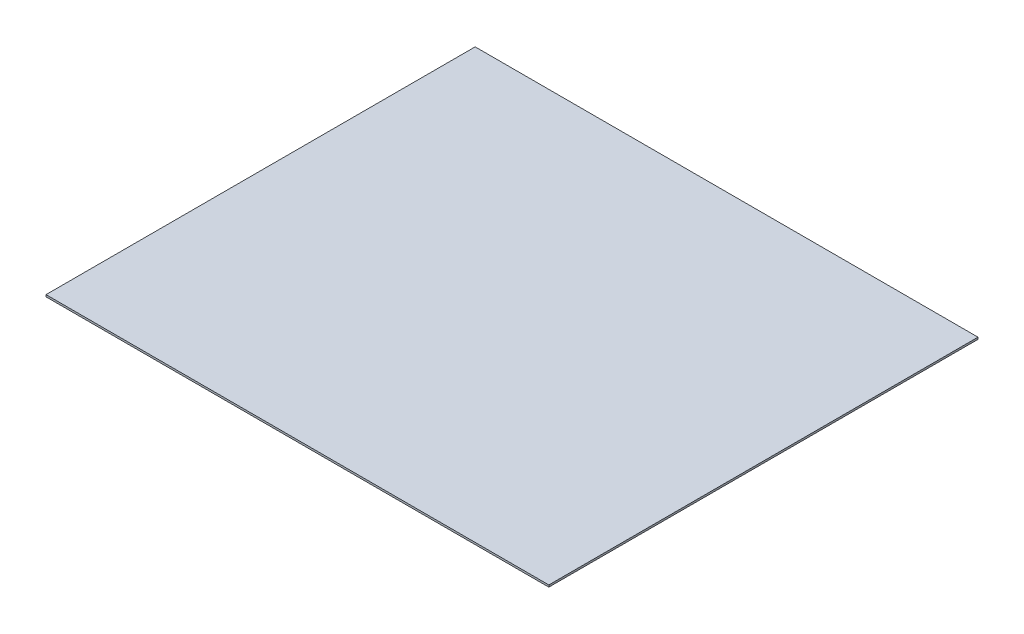
ISO-10303-21;
HEADER;
FILE_DESCRIPTION(('STEP AP214'),'2;1');
FILE_NAME('part.step','',(''),(''),'','','');
FILE_SCHEMA(('AUTOMOTIVE_DESIGN { 1 0 10303 214 1 1 1 1 }'));
ENDSEC;
DATA;
#1=APPLICATION_CONTEXT('core data for automotive mechanical design processes');
#2=APPLICATION_PROTOCOL_DEFINITION('international standard','automotive_design',2000,#1);
#3=PRODUCT_CONTEXT('',#1,'mechanical');
#4=PRODUCT('Part','Part','',(#3));
#5=PRODUCT_RELATED_PRODUCT_CATEGORY('part','',(#4));
#6=PRODUCT_DEFINITION_FORMATION('','',#4);
#7=PRODUCT_DEFINITION_CONTEXT('part definition',#1,'design');
#8=PRODUCT_DEFINITION('design','',#6,#7);
#9=PRODUCT_DEFINITION_SHAPE('','',#8);
#10=(LENGTH_UNIT() NAMED_UNIT(*) SI_UNIT(.MILLI.,.METRE.));
#11=(NAMED_UNIT(*) PLANE_ANGLE_UNIT() SI_UNIT($,.RADIAN.));
#12=(NAMED_UNIT(*) SI_UNIT($,.STERADIAN.) SOLID_ANGLE_UNIT());
#13=UNCERTAINTY_MEASURE_WITH_UNIT(LENGTH_MEASURE(1.E-05),#10,'distance_accuracy_value','');
#14=(GEOMETRIC_REPRESENTATION_CONTEXT(3) GLOBAL_UNCERTAINTY_ASSIGNED_CONTEXT((#13)) GLOBAL_UNIT_ASSIGNED_CONTEXT((#10,
#11,#12)) REPRESENTATION_CONTEXT('',''));
#15=CARTESIAN_POINT('',(0.,0.,0.));
#16=DIRECTION('',(0.,0.,1.));
#17=DIRECTION('',(1.,0.,0.));
#18=AXIS2_PLACEMENT_3D('',#15,#16,#17);
#19=CARTESIAN_POINT('',(0.,2.54,-565.810000204001));
#20=DIRECTION('',(0.,0.,-1.));
#21=DIRECTION('',(-1.,0.,0.));
#22=AXIS2_PLACEMENT_3D('',#19,#20,#21);
#23=PLANE('',#22);
#24=DIRECTION('',(1.,0.,0.));
#25=VECTOR('',#24,1.);
#26=CARTESIAN_POINT('',(0.,0.,-565.810000204001));
#27=LINE('',#26,#25);
#28=CARTESIAN_POINT('',(0.,0.,-565.810000204001));
#29=VERTEX_POINT('',#28);
#30=CARTESIAN_POINT('',(662.940000000001,0.,-565.810000204001));
#31=VERTEX_POINT('',#30);
#32=EDGE_CURVE('E97',#29,#31,#27,.T.);
#33=ORIENTED_EDGE('',*,*,#32,.F.);
#34=DIRECTION('',(0.,-1.,0.));
#35=VECTOR('',#34,1.);
#36=CARTESIAN_POINT('',(0.,2.54,-565.810000204001));
#37=LINE('',#36,#35);
#38=CARTESIAN_POINT('',(0.,2.54,-565.810000204001));
#39=VERTEX_POINT('',#38);
#40=EDGE_CURVE('E11',#39,#29,#37,.T.);
#41=ORIENTED_EDGE('',*,*,#40,.F.);
#42=DIRECTION('',(1.,0.,0.));
#43=VECTOR('',#42,1.);
#44=CARTESIAN_POINT('',(0.,2.54,-565.810000204001));
#45=LINE('',#44,#43);
#46=CARTESIAN_POINT('',(662.940000000001,2.54,-565.810000204001));
#47=VERTEX_POINT('',#46);
#48=EDGE_CURVE('E91',#39,#47,#45,.T.);
#49=ORIENTED_EDGE('',*,*,#48,.T.);
#50=DIRECTION('',(0.,-1.,0.));
#51=VECTOR('',#50,1.);
#52=CARTESIAN_POINT('',(662.940000000001,2.54,-565.810000204001));
#53=LINE('',#52,#51);
#54=EDGE_CURVE('E36',#47,#31,#53,.T.);
#55=ORIENTED_EDGE('',*,*,#54,.T.);
#56=EDGE_LOOP('',(#33,#41,#49,#55));
#57=FACE_BOUND('',#56,.T.);
#58=ADVANCED_FACE('F33',(#57),#23,.T.);
#59=CARTESIAN_POINT('',(0.,2.54,0.));
#60=DIRECTION('',(-1.,0.,0.));
#61=DIRECTION('',(0.,0.,1.));
#62=AXIS2_PLACEMENT_3D('',#59,#60,#61);
#63=PLANE('',#62);
#64=DIRECTION('',(0.,0.,-1.));
#65=VECTOR('',#64,1.);
#66=CARTESIAN_POINT('',(0.,0.,0.));
#67=LINE('',#66,#65);
#68=CARTESIAN_POINT('',(0.,0.,0.));
#69=VERTEX_POINT('',#68);
#70=EDGE_CURVE('E93',#69,#29,#67,.T.);
#71=ORIENTED_EDGE('',*,*,#70,.F.);
#72=DIRECTION('',(0.,-1.,0.));
#73=VECTOR('',#72,1.);
#74=CARTESIAN_POINT('',(0.,2.54,0.));
#75=LINE('',#74,#73);
#76=CARTESIAN_POINT('',(0.,2.54,0.));
#77=VERTEX_POINT('',#76);
#78=EDGE_CURVE('E42',#77,#69,#75,.T.);
#79=ORIENTED_EDGE('',*,*,#78,.F.);
#80=DIRECTION('',(0.,0.,-1.));
#81=VECTOR('',#80,1.);
#82=CARTESIAN_POINT('',(0.,2.54,0.));
#83=LINE('',#82,#81);
#84=EDGE_CURVE('E81',#77,#39,#83,.T.);
#85=ORIENTED_EDGE('',*,*,#84,.T.);
#86=ORIENTED_EDGE('',*,*,#40,.T.);
#87=EDGE_LOOP('',(#71,#79,#85,#86));
#88=FACE_BOUND('',#87,.T.);
#89=ADVANCED_FACE('F107',(#88),#63,.T.);
#90=CARTESIAN_POINT('',(0.,2.54,0.));
#91=DIRECTION('',(0.,0.,-1.));
#92=DIRECTION('',(-1.,0.,0.));
#93=AXIS2_PLACEMENT_3D('',#90,#91,#92);
#94=PLANE('',#93);
#95=DIRECTION('',(1.,0.,0.));
#96=VECTOR('',#95,1.);
#97=CARTESIAN_POINT('',(0.,0.,0.));
#98=LINE('',#97,#96);
#99=CARTESIAN_POINT('',(662.940000000001,0.,0.));
#100=VERTEX_POINT('',#99);
#101=EDGE_CURVE('E86',#69,#100,#98,.T.);
#102=ORIENTED_EDGE('',*,*,#101,.T.);
#103=DIRECTION('',(0.,-1.,0.));
#104=VECTOR('',#103,1.);
#105=CARTESIAN_POINT('',(662.940000000001,2.54,0.));
#106=LINE('',#105,#104);
#107=CARTESIAN_POINT('',(662.940000000001,2.54,0.));
#108=VERTEX_POINT('',#107);
#109=EDGE_CURVE('E84',#108,#100,#106,.T.);
#110=ORIENTED_EDGE('',*,*,#109,.F.);
#111=DIRECTION('',(1.,0.,0.));
#112=VECTOR('',#111,1.);
#113=CARTESIAN_POINT('',(0.,2.54,0.));
#114=LINE('',#113,#112);
#115=EDGE_CURVE('E78',#77,#108,#114,.T.);
#116=ORIENTED_EDGE('',*,*,#115,.F.);
#117=ORIENTED_EDGE('',*,*,#78,.T.);
#118=EDGE_LOOP('',(#102,#110,#116,#117));
#119=FACE_BOUND('',#118,.T.);
#120=ADVANCED_FACE('F85',(#119),#94,.F.);
#121=CARTESIAN_POINT('',(662.940000000001,2.54,0.));
#122=DIRECTION('',(-1.,0.,0.));
#123=DIRECTION('',(0.,0.,1.));
#124=AXIS2_PLACEMENT_3D('',#121,#122,#123);
#125=PLANE('',#124);
#126=DIRECTION('',(0.,0.,-1.));
#127=VECTOR('',#126,1.);
#128=CARTESIAN_POINT('',(662.940000000001,0.,0.));
#129=LINE('',#128,#127);
#130=EDGE_CURVE('E100',#100,#31,#129,.T.);
#131=ORIENTED_EDGE('',*,*,#130,.T.);
#132=ORIENTED_EDGE('',*,*,#54,.F.);
#133=DIRECTION('',(0.,0.,-1.));
#134=VECTOR('',#133,1.);
#135=CARTESIAN_POINT('',(662.940000000001,2.54,0.));
#136=LINE('',#135,#134);
#137=EDGE_CURVE('E75',#108,#47,#136,.T.);
#138=ORIENTED_EDGE('',*,*,#137,.F.);
#139=ORIENTED_EDGE('',*,*,#109,.T.);
#140=EDGE_LOOP('',(#131,#132,#138,#139));
#141=FACE_BOUND('',#140,.T.);
#142=ADVANCED_FACE('F90',(#141),#125,.F.);
#143=CARTESIAN_POINT('',(0.,2.54,0.));
#144=DIRECTION('',(0.,1.,0.));
#145=DIRECTION('',(0.,0.,1.));
#146=AXIS2_PLACEMENT_3D('',#143,#144,#145);
#147=PLANE('',#146);
#148=ORIENTED_EDGE('',*,*,#48,.F.);
#149=ORIENTED_EDGE('',*,*,#84,.F.);
#150=ORIENTED_EDGE('',*,*,#115,.T.);
#151=ORIENTED_EDGE('',*,*,#137,.T.);
#152=EDGE_LOOP('',(#148,#149,#150,#151));
#153=FACE_BOUND('',#152,.T.);
#154=ADVANCED_FACE('F80',(#153),#147,.T.);
#155=CARTESIAN_POINT('',(0.,0.,0.));
#156=DIRECTION('',(0.,1.,0.));
#157=DIRECTION('',(0.,0.,1.));
#158=AXIS2_PLACEMENT_3D('',#155,#156,#157);
#159=PLANE('',#158);
#160=ORIENTED_EDGE('',*,*,#32,.T.);
#161=ORIENTED_EDGE('',*,*,#130,.F.);
#162=ORIENTED_EDGE('',*,*,#101,.F.);
#163=ORIENTED_EDGE('',*,*,#70,.T.);
#164=EDGE_LOOP('',(#160,#161,#162,#163));
#165=FACE_BOUND('',#164,.T.);
#166=ADVANCED_FACE('F106',(#165),#159,.F.);
#167=CLOSED_SHELL('',(#58,#89,#120,#142,#154,#166));
#168=MANIFOLD_SOLID_BREP('B2',#167);
#169=ADVANCED_BREP_SHAPE_REPRESENTATION('',(#18,#168),#14);
#170=SHAPE_DEFINITION_REPRESENTATION(#9,#169);
ENDSEC;
END-ISO-10303-21;
